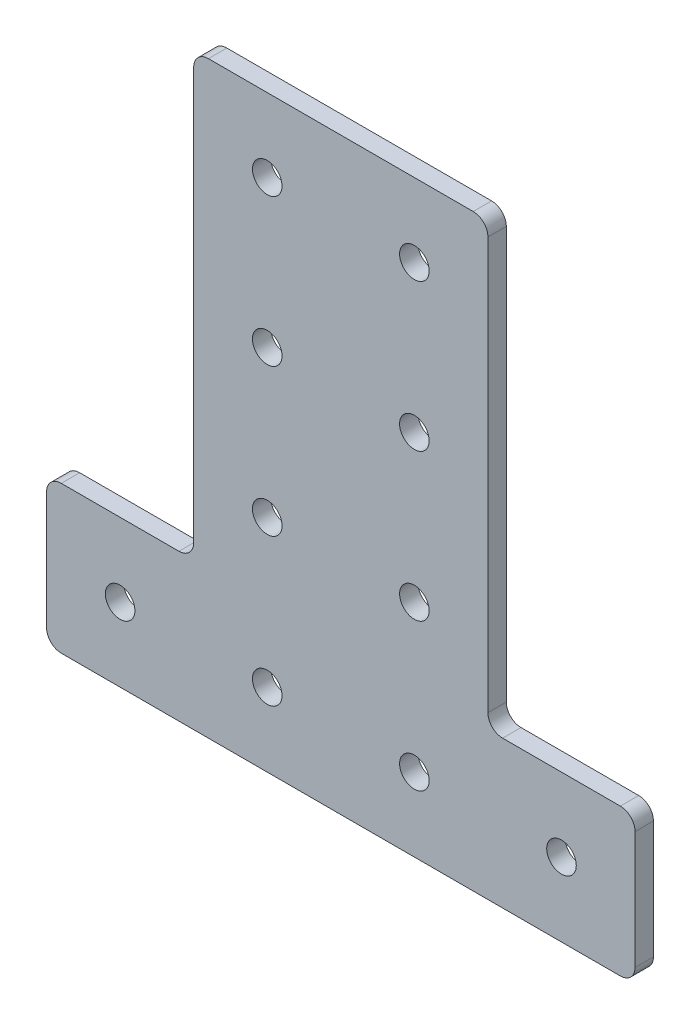
ISO-10303-21;
HEADER;
FILE_DESCRIPTION(('STEP AP214'),'2;1');
FILE_NAME('part.step','',(''),(''),'','','');
FILE_SCHEMA(('AUTOMOTIVE_DESIGN { 1 0 10303 214 1 1 1 1 }'));
ENDSEC;
DATA;
#1=APPLICATION_CONTEXT('core data for automotive mechanical design processes');
#2=APPLICATION_PROTOCOL_DEFINITION('international standard','automotive_design',2000,#1);
#3=PRODUCT_CONTEXT('',#1,'mechanical');
#4=PRODUCT('Part','Part','',(#3));
#5=PRODUCT_RELATED_PRODUCT_CATEGORY('part','',(#4));
#6=PRODUCT_DEFINITION_FORMATION('','',#4);
#7=PRODUCT_DEFINITION_CONTEXT('part definition',#1,'design');
#8=PRODUCT_DEFINITION('design','',#6,#7);
#9=PRODUCT_DEFINITION_SHAPE('','',#8);
#10=(LENGTH_UNIT() NAMED_UNIT(*) SI_UNIT(.MILLI.,.METRE.));
#11=(NAMED_UNIT(*) PLANE_ANGLE_UNIT() SI_UNIT($,.RADIAN.));
#12=(NAMED_UNIT(*) SI_UNIT($,.STERADIAN.) SOLID_ANGLE_UNIT());
#13=UNCERTAINTY_MEASURE_WITH_UNIT(LENGTH_MEASURE(1.E-05),#10,'distance_accuracy_value','');
#14=(GEOMETRIC_REPRESENTATION_CONTEXT(3) GLOBAL_UNCERTAINTY_ASSIGNED_CONTEXT((#13)) GLOBAL_UNIT_ASSIGNED_CONTEXT((#10,
#11,#12)) REPRESENTATION_CONTEXT('',''));
#15=CARTESIAN_POINT('',(0.,0.,0.));
#16=DIRECTION('',(0.,0.,1.));
#17=DIRECTION('',(1.,0.,0.));
#18=AXIS2_PLACEMENT_3D('',#15,#16,#17);
#19=CARTESIAN_POINT('',(0.,0.,3.175));
#20=DIRECTION('',(0.,0.,1.));
#21=DIRECTION('',(1.,0.,0.));
#22=AXIS2_PLACEMENT_3D('',#19,#20,#21);
#23=PLANE('',#22);
#24=CARTESIAN_POINT('',(-63.5,12.7,3.175));
#25=DIRECTION('',(0.,0.,1.));
#26=DIRECTION('',(1.,0.,0.));
#27=AXIS2_PLACEMENT_3D('',#24,#25,#26);
#28=CIRCLE('',#27,2.55269999999999);
#29=CARTESIAN_POINT('',(-60.9473,12.7,3.175));
#30=VERTEX_POINT('',#29);
#31=EDGE_CURVE('E465',#30,#30,#28,.F.);
#32=ORIENTED_EDGE('',*,*,#31,.T.);
#33=EDGE_LOOP('',(#32));
#34=FACE_BOUND('',#33,.T.);
#35=CARTESIAN_POINT('',(-38.1,12.7,3.175));
#36=DIRECTION('',(0.,0.,1.));
#37=DIRECTION('',(1.,0.,0.));
#38=AXIS2_PLACEMENT_3D('',#35,#36,#37);
#39=CIRCLE('',#38,2.55269999999999);
#40=CARTESIAN_POINT('',(-35.5473,12.7,3.175));
#41=VERTEX_POINT('',#40);
#42=EDGE_CURVE('E457',#41,#41,#39,.F.);
#43=ORIENTED_EDGE('',*,*,#42,.T.);
#44=EDGE_LOOP('',(#43));
#45=FACE_BOUND('',#44,.T.);
#46=CARTESIAN_POINT('',(-12.7,12.7,3.175));
#47=DIRECTION('',(0.,0.,1.));
#48=DIRECTION('',(1.,0.,0.));
#49=AXIS2_PLACEMENT_3D('',#46,#47,#48);
#50=CIRCLE('',#49,2.55269999999999);
#51=CARTESIAN_POINT('',(-10.1473,12.7,3.175));
#52=VERTEX_POINT('',#51);
#53=EDGE_CURVE('E446',#52,#52,#50,.F.);
#54=ORIENTED_EDGE('',*,*,#53,.T.);
#55=EDGE_LOOP('',(#54));
#56=FACE_BOUND('',#55,.T.);
#57=CARTESIAN_POINT('',(-63.5,88.9,3.175));
#58=DIRECTION('',(0.,0.,1.));
#59=DIRECTION('',(1.,0.,0.));
#60=AXIS2_PLACEMENT_3D('',#57,#58,#59);
#61=CIRCLE('',#60,2.55269999999999);
#62=CARTESIAN_POINT('',(-60.9473,88.9,3.175));
#63=VERTEX_POINT('',#62);
#64=EDGE_CURVE('E442',#63,#63,#61,.T.);
#65=ORIENTED_EDGE('',*,*,#64,.F.);
#66=EDGE_LOOP('',(#65));
#67=FACE_BOUND('',#66,.T.);
#68=CARTESIAN_POINT('',(-63.5,63.5,3.175));
#69=DIRECTION('',(0.,0.,1.));
#70=DIRECTION('',(1.,0.,0.));
#71=AXIS2_PLACEMENT_3D('',#68,#69,#70);
#72=CIRCLE('',#71,2.55269999999999);
#73=CARTESIAN_POINT('',(-60.9473,63.5,3.175));
#74=VERTEX_POINT('',#73);
#75=EDGE_CURVE('E434',#74,#74,#72,.T.);
#76=ORIENTED_EDGE('',*,*,#75,.F.);
#77=EDGE_LOOP('',(#76));
#78=FACE_BOUND('',#77,.T.);
#79=CARTESIAN_POINT('',(-63.5,38.1,3.175));
#80=DIRECTION('',(0.,0.,1.));
#81=DIRECTION('',(1.,0.,0.));
#82=AXIS2_PLACEMENT_3D('',#79,#80,#81);
#83=CIRCLE('',#82,2.55269999999999);
#84=CARTESIAN_POINT('',(-60.9473,38.1,3.175));
#85=VERTEX_POINT('',#84);
#86=EDGE_CURVE('E426',#85,#85,#83,.T.);
#87=ORIENTED_EDGE('',*,*,#86,.F.);
#88=EDGE_LOOP('',(#87));
#89=FACE_BOUND('',#88,.T.);
#90=CARTESIAN_POINT('',(-38.1,88.9,3.175));
#91=DIRECTION('',(0.,0.,1.));
#92=DIRECTION('',(1.,0.,0.));
#93=AXIS2_PLACEMENT_3D('',#90,#91,#92);
#94=CIRCLE('',#93,2.55269999999999);
#95=CARTESIAN_POINT('',(-35.5473,88.9,3.175));
#96=VERTEX_POINT('',#95);
#97=EDGE_CURVE('E418',#96,#96,#94,.T.);
#98=ORIENTED_EDGE('',*,*,#97,.F.);
#99=EDGE_LOOP('',(#98));
#100=FACE_BOUND('',#99,.T.);
#101=CARTESIAN_POINT('',(-38.1,63.5,3.175));
#102=DIRECTION('',(0.,0.,1.));
#103=DIRECTION('',(1.,0.,0.));
#104=AXIS2_PLACEMENT_3D('',#101,#102,#103);
#105=CIRCLE('',#104,2.55269999999999);
#106=CARTESIAN_POINT('',(-35.5473,63.5,3.175));
#107=VERTEX_POINT('',#106);
#108=EDGE_CURVE('E410',#107,#107,#105,.T.);
#109=ORIENTED_EDGE('',*,*,#108,.F.);
#110=EDGE_LOOP('',(#109));
#111=FACE_BOUND('',#110,.T.);
#112=CARTESIAN_POINT('',(-38.1,38.1,3.175));
#113=DIRECTION('',(0.,0.,1.));
#114=DIRECTION('',(1.,0.,0.));
#115=AXIS2_PLACEMENT_3D('',#112,#113,#114);
#116=CIRCLE('',#115,2.55269999999999);
#117=CARTESIAN_POINT('',(-35.5473,38.1,3.175));
#118=VERTEX_POINT('',#117);
#119=EDGE_CURVE('E402',#118,#118,#116,.T.);
#120=ORIENTED_EDGE('',*,*,#119,.F.);
#121=EDGE_LOOP('',(#120));
#122=FACE_BOUND('',#121,.T.);
#123=DIRECTION('',(0.,-1.,0.));
#124=VECTOR('',#123,1.);
#125=CARTESIAN_POINT('',(-101.6,0.,3.175));
#126=LINE('',#125,#124);
#127=CARTESIAN_POINT('',(-101.6,22.86,3.175));
#128=VERTEX_POINT('',#127);
#129=CARTESIAN_POINT('',(-101.6,2.53999999999999,3.175));
#130=VERTEX_POINT('',#129);
#131=EDGE_CURVE('E327',#128,#130,#126,.T.);
#132=ORIENTED_EDGE('',*,*,#131,.T.);
#133=CARTESIAN_POINT('',(-99.06,2.53999999999999,3.175));
#134=DIRECTION('',(0.,0.,1.));
#135=DIRECTION('',(1.,0.,0.));
#136=AXIS2_PLACEMENT_3D('',#133,#134,#135);
#137=CIRCLE('',#136,2.54);
#138=CARTESIAN_POINT('',(-99.06,0.,3.175));
#139=VERTEX_POINT('',#138);
#140=EDGE_CURVE('E268',#130,#139,#137,.T.);
#141=ORIENTED_EDGE('',*,*,#140,.T.);
#142=DIRECTION('',(1.,0.,0.));
#143=VECTOR('',#142,1.);
#144=CARTESIAN_POINT('',(0.,0.,3.175));
#145=LINE('',#144,#143);
#146=CARTESIAN_POINT('',(-2.54,0.,3.175));
#147=VERTEX_POINT('',#146);
#148=EDGE_CURVE('E202',#139,#147,#145,.T.);
#149=ORIENTED_EDGE('',*,*,#148,.T.);
#150=CARTESIAN_POINT('',(-2.54,2.54,3.175));
#151=DIRECTION('',(0.,0.,1.));
#152=DIRECTION('',(1.,0.,0.));
#153=AXIS2_PLACEMENT_3D('',#150,#151,#152);
#154=CIRCLE('',#153,2.54);
#155=CARTESIAN_POINT('',(0.,2.54,3.175));
#156=VERTEX_POINT('',#155);
#157=EDGE_CURVE('E257',#147,#156,#154,.T.);
#158=ORIENTED_EDGE('',*,*,#157,.T.);
#159=DIRECTION('',(0.,1.,0.));
#160=VECTOR('',#159,1.);
#161=CARTESIAN_POINT('',(0.,0.,3.175));
#162=LINE('',#161,#160);
#163=CARTESIAN_POINT('',(0.,22.86,3.175));
#164=VERTEX_POINT('',#163);
#165=EDGE_CURVE('E200',#156,#164,#162,.T.);
#166=ORIENTED_EDGE('',*,*,#165,.T.);
#167=CARTESIAN_POINT('',(-2.54,22.86,3.175));
#168=DIRECTION('',(0.,0.,1.));
#169=DIRECTION('',(1.,0.,0.));
#170=AXIS2_PLACEMENT_3D('',#167,#168,#169);
#171=CIRCLE('',#170,2.54);
#172=CARTESIAN_POINT('',(-2.54,25.4,3.175));
#173=VERTEX_POINT('',#172);
#174=EDGE_CURVE('E254',#164,#173,#171,.T.);
#175=ORIENTED_EDGE('',*,*,#174,.T.);
#176=DIRECTION('',(-1.,0.,0.));
#177=VECTOR('',#176,1.);
#178=CARTESIAN_POINT('',(0.,25.4,3.175));
#179=LINE('',#178,#177);
#180=CARTESIAN_POINT('',(-22.86,25.4,3.175));
#181=VERTEX_POINT('',#180);
#182=EDGE_CURVE('E308',#173,#181,#179,.T.);
#183=ORIENTED_EDGE('',*,*,#182,.T.);
#184=CARTESIAN_POINT('',(-22.86,27.94,3.175));
#185=DIRECTION('',(0.,0.,1.));
#186=DIRECTION('',(1.,0.,0.));
#187=AXIS2_PLACEMENT_3D('',#184,#185,#186);
#188=CIRCLE('',#187,2.54);
#189=CARTESIAN_POINT('',(-25.4,27.94,3.175));
#190=VERTEX_POINT('',#189);
#191=EDGE_CURVE('E11',#181,#190,#188,.F.);
#192=ORIENTED_EDGE('',*,*,#191,.T.);
#193=DIRECTION('',(0.,1.,0.));
#194=VECTOR('',#193,1.);
#195=CARTESIAN_POINT('',(-25.4,25.4,3.175));
#196=LINE('',#195,#194);
#197=CARTESIAN_POINT('',(-25.4,99.06,3.175));
#198=VERTEX_POINT('',#197);
#199=EDGE_CURVE('E307',#190,#198,#196,.T.);
#200=ORIENTED_EDGE('',*,*,#199,.T.);
#201=CARTESIAN_POINT('',(-27.94,99.06,3.175));
#202=DIRECTION('',(0.,0.,1.));
#203=DIRECTION('',(1.,0.,0.));
#204=AXIS2_PLACEMENT_3D('',#201,#202,#203);
#205=CIRCLE('',#204,2.54);
#206=CARTESIAN_POINT('',(-27.94,101.6,3.175));
#207=VERTEX_POINT('',#206);
#208=EDGE_CURVE('E61',#198,#207,#205,.T.);
#209=ORIENTED_EDGE('',*,*,#208,.T.);
#210=DIRECTION('',(-1.,0.,0.));
#211=VECTOR('',#210,1.);
#212=CARTESIAN_POINT('',(-76.2,101.6,3.175));
#213=LINE('',#212,#211);
#214=CARTESIAN_POINT('',(-73.66,101.6,3.175));
#215=VERTEX_POINT('',#214);
#216=EDGE_CURVE('E313',#207,#215,#213,.T.);
#217=ORIENTED_EDGE('',*,*,#216,.T.);
#218=CARTESIAN_POINT('',(-73.66,99.06,3.175));
#219=DIRECTION('',(0.,0.,1.));
#220=DIRECTION('',(1.,0.,0.));
#221=AXIS2_PLACEMENT_3D('',#218,#219,#220);
#222=CIRCLE('',#221,2.54);
#223=CARTESIAN_POINT('',(-76.2,99.06,3.175));
#224=VERTEX_POINT('',#223);
#225=EDGE_CURVE('E262',#215,#224,#222,.T.);
#226=ORIENTED_EDGE('',*,*,#225,.T.);
#227=DIRECTION('',(0.,-1.,0.));
#228=VECTOR('',#227,1.);
#229=CARTESIAN_POINT('',(-76.2,25.4,3.175));
#230=LINE('',#229,#228);
#231=CARTESIAN_POINT('',(-76.2,27.94,3.175));
#232=VERTEX_POINT('',#231);
#233=EDGE_CURVE('E317',#224,#232,#230,.T.);
#234=ORIENTED_EDGE('',*,*,#233,.T.);
#235=CARTESIAN_POINT('',(-78.74,27.94,3.175));
#236=DIRECTION('',(0.,0.,1.));
#237=DIRECTION('',(1.,0.,0.));
#238=AXIS2_PLACEMENT_3D('',#235,#236,#237);
#239=CIRCLE('',#238,2.54);
#240=CARTESIAN_POINT('',(-78.74,25.4,3.175));
#241=VERTEX_POINT('',#240);
#242=EDGE_CURVE('E164',#232,#241,#239,.F.);
#243=ORIENTED_EDGE('',*,*,#242,.T.);
#244=DIRECTION('',(-1.,0.,0.));
#245=VECTOR('',#244,1.);
#246=CARTESIAN_POINT('',(-76.2,25.4,3.175));
#247=LINE('',#246,#245);
#248=CARTESIAN_POINT('',(-99.06,25.4,3.175));
#249=VERTEX_POINT('',#248);
#250=EDGE_CURVE('E174',#241,#249,#247,.T.);
#251=ORIENTED_EDGE('',*,*,#250,.T.);
#252=CARTESIAN_POINT('',(-99.06,22.86,3.175));
#253=DIRECTION('',(0.,0.,1.));
#254=DIRECTION('',(1.,0.,0.));
#255=AXIS2_PLACEMENT_3D('',#252,#253,#254);
#256=CIRCLE('',#255,2.54);
#257=EDGE_CURVE('E265',#249,#128,#256,.T.);
#258=ORIENTED_EDGE('',*,*,#257,.T.);
#259=EDGE_LOOP('',(#132,#141,#149,#158,#166,#175,#183,#192,#200,#209,#217,#226,#234,#243,#251,#258));
#260=FACE_BOUND('',#259,.T.);
#261=CARTESIAN_POINT('',(-88.9,12.7,3.175));
#262=DIRECTION('',(0.,0.,1.));
#263=DIRECTION('',(1.,0.,0.));
#264=AXIS2_PLACEMENT_3D('',#261,#262,#263);
#265=CIRCLE('',#264,2.5527);
#266=CARTESIAN_POINT('',(-86.3473,12.7,3.175));
#267=VERTEX_POINT('',#266);
#268=EDGE_CURVE('E472',#267,#267,#265,.F.);
#269=ORIENTED_EDGE('',*,*,#268,.T.);
#270=EDGE_LOOP('',(#269));
#271=FACE_BOUND('',#270,.T.);
#272=ADVANCED_FACE('F38',(#34,#45,#56,#67,#78,#89,#100,#111,#122,#260,#271),#23,.T.);
#273=CARTESIAN_POINT('',(0.,0.,0.));
#274=DIRECTION('',(0.,0.,1.));
#275=DIRECTION('',(1.,0.,0.));
#276=AXIS2_PLACEMENT_3D('',#273,#274,#275);
#277=PLANE('',#276);
#278=CARTESIAN_POINT('',(-88.9,12.7,0.));
#279=DIRECTION('',(0.,0.,-1.));
#280=DIRECTION('',(-1.,0.,0.));
#281=AXIS2_PLACEMENT_3D('',#278,#279,#280);
#282=CIRCLE('',#281,2.55269999999999);
#283=CARTESIAN_POINT('',(-91.4527,12.7,0.));
#284=VERTEX_POINT('',#283);
#285=EDGE_CURVE('E476',#284,#284,#282,.T.);
#286=ORIENTED_EDGE('',*,*,#285,.F.);
#287=EDGE_LOOP('',(#286));
#288=FACE_BOUND('',#287,.T.);
#289=CARTESIAN_POINT('',(-63.5,12.7,0.));
#290=DIRECTION('',(0.,0.,-1.));
#291=DIRECTION('',(-1.,0.,0.));
#292=AXIS2_PLACEMENT_3D('',#289,#290,#291);
#293=CIRCLE('',#292,2.55269999999999);
#294=CARTESIAN_POINT('',(-66.0527,12.7,0.));
#295=VERTEX_POINT('',#294);
#296=EDGE_CURVE('E468',#295,#295,#293,.T.);
#297=ORIENTED_EDGE('',*,*,#296,.F.);
#298=EDGE_LOOP('',(#297));
#299=FACE_BOUND('',#298,.T.);
#300=CARTESIAN_POINT('',(-38.1,12.7,0.));
#301=DIRECTION('',(0.,0.,-1.));
#302=DIRECTION('',(-1.,0.,0.));
#303=AXIS2_PLACEMENT_3D('',#300,#301,#302);
#304=CIRCLE('',#303,2.55269999999999);
#305=CARTESIAN_POINT('',(-40.6527,12.7,0.));
#306=VERTEX_POINT('',#305);
#307=EDGE_CURVE('E461',#306,#306,#304,.T.);
#308=ORIENTED_EDGE('',*,*,#307,.F.);
#309=EDGE_LOOP('',(#308));
#310=FACE_BOUND('',#309,.T.);
#311=CARTESIAN_POINT('',(-12.7,12.7,0.));
#312=DIRECTION('',(0.,0.,-1.));
#313=DIRECTION('',(-1.,0.,0.));
#314=AXIS2_PLACEMENT_3D('',#311,#312,#313);
#315=CIRCLE('',#314,2.55269999999999);
#316=CARTESIAN_POINT('',(-15.2527,12.7,0.));
#317=VERTEX_POINT('',#316);
#318=EDGE_CURVE('E453',#317,#317,#315,.T.);
#319=ORIENTED_EDGE('',*,*,#318,.F.);
#320=EDGE_LOOP('',(#319));
#321=FACE_BOUND('',#320,.T.);
#322=CARTESIAN_POINT('',(-63.5,38.1,0.));
#323=DIRECTION('',(0.,0.,1.));
#324=DIRECTION('',(1.,0.,0.));
#325=AXIS2_PLACEMENT_3D('',#322,#323,#324);
#326=CIRCLE('',#325,2.55269999999999);
#327=CARTESIAN_POINT('',(-60.9473,38.1,0.));
#328=VERTEX_POINT('',#327);
#329=EDGE_CURVE('E422',#328,#328,#326,.F.);
#330=ORIENTED_EDGE('',*,*,#329,.F.);
#331=EDGE_LOOP('',(#330));
#332=FACE_BOUND('',#331,.T.);
#333=CARTESIAN_POINT('',(-38.1,88.9,0.));
#334=DIRECTION('',(0.,0.,1.));
#335=DIRECTION('',(1.,0.,0.));
#336=AXIS2_PLACEMENT_3D('',#333,#334,#335);
#337=CIRCLE('',#336,2.55269999999999);
#338=CARTESIAN_POINT('',(-35.5473,88.9,0.));
#339=VERTEX_POINT('',#338);
#340=EDGE_CURVE('E414',#339,#339,#337,.F.);
#341=ORIENTED_EDGE('',*,*,#340,.F.);
#342=EDGE_LOOP('',(#341));
#343=FACE_BOUND('',#342,.T.);
#344=CARTESIAN_POINT('',(-38.1,38.1,0.));
#345=DIRECTION('',(0.,0.,1.));
#346=DIRECTION('',(1.,0.,0.));
#347=AXIS2_PLACEMENT_3D('',#344,#345,#346);
#348=CIRCLE('',#347,2.55269999999999);
#349=CARTESIAN_POINT('',(-35.5473,38.1,0.));
#350=VERTEX_POINT('',#349);
#351=EDGE_CURVE('E335',#350,#350,#348,.F.);
#352=ORIENTED_EDGE('',*,*,#351,.F.);
#353=EDGE_LOOP('',(#352));
#354=FACE_BOUND('',#353,.T.);
#355=DIRECTION('',(1.,0.,0.));
#356=VECTOR('',#355,1.);
#357=CARTESIAN_POINT('',(0.,0.,0.));
#358=LINE('',#357,#356);
#359=CARTESIAN_POINT('',(-99.06,0.,0.));
#360=VERTEX_POINT('',#359);
#361=CARTESIAN_POINT('',(-2.54,0.,0.));
#362=VERTEX_POINT('',#361);
#363=EDGE_CURVE('E191',#360,#362,#358,.T.);
#364=ORIENTED_EDGE('',*,*,#363,.F.);
#365=CARTESIAN_POINT('',(-99.06,2.53999999999999,0.));
#366=DIRECTION('',(0.,0.,1.));
#367=DIRECTION('',(1.,0.,0.));
#368=AXIS2_PLACEMENT_3D('',#365,#366,#367);
#369=CIRCLE('',#368,2.54);
#370=CARTESIAN_POINT('',(-101.6,2.53999999999999,0.));
#371=VERTEX_POINT('',#370);
#372=EDGE_CURVE('E244',#360,#371,#369,.F.);
#373=ORIENTED_EDGE('',*,*,#372,.T.);
#374=DIRECTION('',(0.,-1.,0.));
#375=VECTOR('',#374,1.);
#376=CARTESIAN_POINT('',(-101.6,0.,0.));
#377=LINE('',#376,#375);
#378=CARTESIAN_POINT('',(-101.6,22.86,0.));
#379=VERTEX_POINT('',#378);
#380=EDGE_CURVE('E185',#379,#371,#377,.T.);
#381=ORIENTED_EDGE('',*,*,#380,.F.);
#382=CARTESIAN_POINT('',(-99.06,22.86,0.));
#383=DIRECTION('',(0.,0.,1.));
#384=DIRECTION('',(1.,0.,0.));
#385=AXIS2_PLACEMENT_3D('',#382,#383,#384);
#386=CIRCLE('',#385,2.54);
#387=CARTESIAN_POINT('',(-99.06,25.4,0.));
#388=VERTEX_POINT('',#387);
#389=EDGE_CURVE('E183',#379,#388,#386,.F.);
#390=ORIENTED_EDGE('',*,*,#389,.T.);
#391=DIRECTION('',(-1.,0.,0.));
#392=VECTOR('',#391,1.);
#393=CARTESIAN_POINT('',(-76.2,25.4,0.));
#394=LINE('',#393,#392);
#395=CARTESIAN_POINT('',(-78.74,25.4,0.));
#396=VERTEX_POINT('',#395);
#397=EDGE_CURVE('E171',#396,#388,#394,.T.);
#398=ORIENTED_EDGE('',*,*,#397,.F.);
#399=CARTESIAN_POINT('',(-78.74,27.94,0.));
#400=DIRECTION('',(0.,0.,1.));
#401=DIRECTION('',(1.,0.,0.));
#402=AXIS2_PLACEMENT_3D('',#399,#400,#401);
#403=CIRCLE('',#402,2.54);
#404=CARTESIAN_POINT('',(-76.2,27.94,0.));
#405=VERTEX_POINT('',#404);
#406=EDGE_CURVE('E153',#396,#405,#403,.T.);
#407=ORIENTED_EDGE('',*,*,#406,.T.);
#408=DIRECTION('',(0.,-1.,0.));
#409=VECTOR('',#408,1.);
#410=CARTESIAN_POINT('',(-76.2,25.4,0.));
#411=LINE('',#410,#409);
#412=CARTESIAN_POINT('',(-76.2,99.06,0.));
#413=VERTEX_POINT('',#412);
#414=EDGE_CURVE('E186',#413,#405,#411,.T.);
#415=ORIENTED_EDGE('',*,*,#414,.F.);
#416=CARTESIAN_POINT('',(-73.66,99.06,0.));
#417=DIRECTION('',(0.,0.,1.));
#418=DIRECTION('',(1.,0.,0.));
#419=AXIS2_PLACEMENT_3D('',#416,#417,#418);
#420=CIRCLE('',#419,2.54);
#421=CARTESIAN_POINT('',(-73.66,101.6,0.));
#422=VERTEX_POINT('',#421);
#423=EDGE_CURVE('E239',#413,#422,#420,.F.);
#424=ORIENTED_EDGE('',*,*,#423,.T.);
#425=DIRECTION('',(-1.,0.,0.));
#426=VECTOR('',#425,1.);
#427=CARTESIAN_POINT('',(-76.2,101.6,0.));
#428=LINE('',#427,#426);
#429=CARTESIAN_POINT('',(-27.94,101.6,0.));
#430=VERTEX_POINT('',#429);
#431=EDGE_CURVE('E193',#430,#422,#428,.T.);
#432=ORIENTED_EDGE('',*,*,#431,.F.);
#433=CARTESIAN_POINT('',(-27.94,99.06,0.));
#434=DIRECTION('',(0.,0.,1.));
#435=DIRECTION('',(1.,0.,0.));
#436=AXIS2_PLACEMENT_3D('',#433,#434,#435);
#437=CIRCLE('',#436,2.54);
#438=CARTESIAN_POINT('',(-25.4,99.06,0.));
#439=VERTEX_POINT('',#438);
#440=EDGE_CURVE('E236',#430,#439,#437,.F.);
#441=ORIENTED_EDGE('',*,*,#440,.T.);
#442=DIRECTION('',(0.,1.,0.));
#443=VECTOR('',#442,1.);
#444=CARTESIAN_POINT('',(-25.4,25.4,0.));
#445=LINE('',#444,#443);
#446=CARTESIAN_POINT('',(-25.4,27.94,0.));
#447=VERTEX_POINT('',#446);
#448=EDGE_CURVE('E290',#447,#439,#445,.T.);
#449=ORIENTED_EDGE('',*,*,#448,.F.);
#450=CARTESIAN_POINT('',(-22.86,27.94,0.));
#451=DIRECTION('',(0.,0.,1.));
#452=DIRECTION('',(1.,0.,0.));
#453=AXIS2_PLACEMENT_3D('',#450,#451,#452);
#454=CIRCLE('',#453,2.54);
#455=CARTESIAN_POINT('',(-22.86,25.4,0.));
#456=VERTEX_POINT('',#455);
#457=EDGE_CURVE('E47',#447,#456,#454,.T.);
#458=ORIENTED_EDGE('',*,*,#457,.T.);
#459=DIRECTION('',(-1.,0.,0.));
#460=VECTOR('',#459,1.);
#461=CARTESIAN_POINT('',(0.,25.4,0.));
#462=LINE('',#461,#460);
#463=CARTESIAN_POINT('',(-2.54,25.4,0.));
#464=VERTEX_POINT('',#463);
#465=EDGE_CURVE('E288',#464,#456,#462,.T.);
#466=ORIENTED_EDGE('',*,*,#465,.F.);
#467=CARTESIAN_POINT('',(-2.54,22.86,0.));
#468=DIRECTION('',(0.,0.,1.));
#469=DIRECTION('',(1.,0.,0.));
#470=AXIS2_PLACEMENT_3D('',#467,#468,#469);
#471=CIRCLE('',#470,2.54);
#472=CARTESIAN_POINT('',(0.,22.86,0.));
#473=VERTEX_POINT('',#472);
#474=EDGE_CURVE('E230',#464,#473,#471,.F.);
#475=ORIENTED_EDGE('',*,*,#474,.T.);
#476=DIRECTION('',(0.,1.,0.));
#477=VECTOR('',#476,1.);
#478=CARTESIAN_POINT('',(0.,0.,0.));
#479=LINE('',#478,#477);
#480=CARTESIAN_POINT('',(0.,2.54,0.));
#481=VERTEX_POINT('',#480);
#482=EDGE_CURVE('E300',#481,#473,#479,.T.);
#483=ORIENTED_EDGE('',*,*,#482,.F.);
#484=CARTESIAN_POINT('',(-2.54,2.54,0.));
#485=DIRECTION('',(0.,0.,1.));
#486=DIRECTION('',(1.,0.,0.));
#487=AXIS2_PLACEMENT_3D('',#484,#485,#486);
#488=CIRCLE('',#487,2.54);
#489=EDGE_CURVE('E233',#481,#362,#488,.F.);
#490=ORIENTED_EDGE('',*,*,#489,.T.);
#491=EDGE_LOOP('',(#364,#373,#381,#390,#398,#407,#415,#424,#432,#441,#449,#458,#466,#475,#483,#490));
#492=FACE_BOUND('',#491,.T.);
#493=CARTESIAN_POINT('',(-38.1,63.5,0.));
#494=DIRECTION('',(0.,0.,1.));
#495=DIRECTION('',(1.,0.,0.));
#496=AXIS2_PLACEMENT_3D('',#493,#494,#495);
#497=CIRCLE('',#496,2.55269999999999);
#498=CARTESIAN_POINT('',(-35.5473,63.5,0.));
#499=VERTEX_POINT('',#498);
#500=EDGE_CURVE('E406',#499,#499,#497,.F.);
#501=ORIENTED_EDGE('',*,*,#500,.F.);
#502=EDGE_LOOP('',(#501));
#503=FACE_BOUND('',#502,.T.);
#504=CARTESIAN_POINT('',(-63.5,63.5,0.));
#505=DIRECTION('',(0.,0.,1.));
#506=DIRECTION('',(1.,0.,0.));
#507=AXIS2_PLACEMENT_3D('',#504,#505,#506);
#508=CIRCLE('',#507,2.55269999999999);
#509=CARTESIAN_POINT('',(-60.9473,63.5,0.));
#510=VERTEX_POINT('',#509);
#511=EDGE_CURVE('E430',#510,#510,#508,.F.);
#512=ORIENTED_EDGE('',*,*,#511,.F.);
#513=EDGE_LOOP('',(#512));
#514=FACE_BOUND('',#513,.T.);
#515=CARTESIAN_POINT('',(-63.5,88.9,0.));
#516=DIRECTION('',(0.,0.,1.));
#517=DIRECTION('',(1.,0.,0.));
#518=AXIS2_PLACEMENT_3D('',#515,#516,#517);
#519=CIRCLE('',#518,2.55269999999999);
#520=CARTESIAN_POINT('',(-60.9473,88.9,0.));
#521=VERTEX_POINT('',#520);
#522=EDGE_CURVE('E438',#521,#521,#519,.F.);
#523=ORIENTED_EDGE('',*,*,#522,.F.);
#524=EDGE_LOOP('',(#523));
#525=FACE_BOUND('',#524,.T.);
#526=ADVANCED_FACE('F180',(#288,#299,#310,#321,#332,#343,#354,#492,#503,#514,#525),#277,.F.);
#527=CARTESIAN_POINT('',(0.,0.,3.175));
#528=DIRECTION('',(-1.,0.,0.));
#529=DIRECTION('',(0.,0.,1.));
#530=AXIS2_PLACEMENT_3D('',#527,#528,#529);
#531=PLANE('',#530);
#532=ORIENTED_EDGE('',*,*,#165,.F.);
#533=DIRECTION('',(0.,0.,-1.));
#534=VECTOR('',#533,1.);
#535=CARTESIAN_POINT('',(0.,2.54,3.175));
#536=LINE('',#535,#534);
#537=EDGE_CURVE('E165',#156,#481,#536,.T.);
#538=ORIENTED_EDGE('',*,*,#537,.T.);
#539=ORIENTED_EDGE('',*,*,#482,.T.);
#540=DIRECTION('',(0.,0.,-1.));
#541=VECTOR('',#540,1.);
#542=CARTESIAN_POINT('',(0.,22.86,3.175));
#543=LINE('',#542,#541);
#544=EDGE_CURVE('E277',#473,#164,#543,.F.);
#545=ORIENTED_EDGE('',*,*,#544,.T.);
#546=EDGE_LOOP('',(#532,#538,#539,#545));
#547=FACE_BOUND('',#546,.T.);
#548=ADVANCED_FACE('F364',(#547),#531,.F.);
#549=CARTESIAN_POINT('',(0.,25.4,3.175));
#550=DIRECTION('',(0.,-1.,0.));
#551=DIRECTION('',(1.,0.,0.));
#552=AXIS2_PLACEMENT_3D('',#549,#550,#551);
#553=PLANE('',#552);
#554=ORIENTED_EDGE('',*,*,#465,.T.);
#555=DIRECTION('',(0.,0.,-1.));
#556=VECTOR('',#555,1.);
#557=CARTESIAN_POINT('',(-22.86,25.4,3.175));
#558=LINE('',#557,#556);
#559=EDGE_CURVE('E220',#456,#181,#558,.F.);
#560=ORIENTED_EDGE('',*,*,#559,.T.);
#561=ORIENTED_EDGE('',*,*,#182,.F.);
#562=DIRECTION('',(0.,0.,-1.));
#563=VECTOR('',#562,1.);
#564=CARTESIAN_POINT('',(-2.54,25.4,3.175));
#565=LINE('',#564,#563);
#566=EDGE_CURVE('E216',#173,#464,#565,.T.);
#567=ORIENTED_EDGE('',*,*,#566,.T.);
#568=EDGE_LOOP('',(#554,#560,#561,#567));
#569=FACE_BOUND('',#568,.T.);
#570=ADVANCED_FACE('F295',(#569),#553,.F.);
#571=CARTESIAN_POINT('',(-25.4,25.4,3.175));
#572=DIRECTION('',(-1.,0.,0.));
#573=DIRECTION('',(0.,-1.,0.));
#574=AXIS2_PLACEMENT_3D('',#571,#572,#573);
#575=PLANE('',#574);
#576=ORIENTED_EDGE('',*,*,#199,.F.);
#577=DIRECTION('',(0.,0.,-1.));
#578=VECTOR('',#577,1.);
#579=CARTESIAN_POINT('',(-25.4,27.94,0.));
#580=LINE('',#579,#578);
#581=EDGE_CURVE('E212',#190,#447,#580,.T.);
#582=ORIENTED_EDGE('',*,*,#581,.T.);
#583=ORIENTED_EDGE('',*,*,#448,.T.);
#584=DIRECTION('',(0.,0.,-1.));
#585=VECTOR('',#584,1.);
#586=CARTESIAN_POINT('',(-25.4,99.06,3.175));
#587=LINE('',#586,#585);
#588=EDGE_CURVE('E209',#439,#198,#587,.F.);
#589=ORIENTED_EDGE('',*,*,#588,.T.);
#590=EDGE_LOOP('',(#576,#582,#583,#589));
#591=FACE_BOUND('',#590,.T.);
#592=ADVANCED_FACE('F310',(#591),#575,.F.);
#593=CARTESIAN_POINT('',(-76.2,101.6,3.175));
#594=DIRECTION('',(0.,-1.,0.));
#595=DIRECTION('',(0.,0.,-1.));
#596=AXIS2_PLACEMENT_3D('',#593,#594,#595);
#597=PLANE('',#596);
#598=ORIENTED_EDGE('',*,*,#431,.T.);
#599=DIRECTION('',(0.,0.,-1.));
#600=VECTOR('',#599,1.);
#601=CARTESIAN_POINT('',(-73.66,101.6,3.175));
#602=LINE('',#601,#600);
#603=EDGE_CURVE('E54',#422,#215,#602,.F.);
#604=ORIENTED_EDGE('',*,*,#603,.T.);
#605=ORIENTED_EDGE('',*,*,#216,.F.);
#606=DIRECTION('',(0.,0.,-1.));
#607=VECTOR('',#606,1.);
#608=CARTESIAN_POINT('',(-27.94,101.6,3.175));
#609=LINE('',#608,#607);
#610=EDGE_CURVE('E271',#207,#430,#609,.T.);
#611=ORIENTED_EDGE('',*,*,#610,.T.);
#612=EDGE_LOOP('',(#598,#604,#605,#611));
#613=FACE_BOUND('',#612,.T.);
#614=ADVANCED_FACE('F340',(#613),#597,.F.);
#615=CARTESIAN_POINT('',(-76.2,25.4,3.175));
#616=DIRECTION('',(1.,0.,0.));
#617=DIRECTION('',(0.,0.,-1.));
#618=AXIS2_PLACEMENT_3D('',#615,#616,#617);
#619=PLANE('',#618);
#620=ORIENTED_EDGE('',*,*,#414,.T.);
#621=DIRECTION('',(0.,0.,-1.));
#622=VECTOR('',#621,1.);
#623=CARTESIAN_POINT('',(-76.2,27.94,3.175));
#624=LINE('',#623,#622);
#625=EDGE_CURVE('E158',#405,#232,#624,.F.);
#626=ORIENTED_EDGE('',*,*,#625,.T.);
#627=ORIENTED_EDGE('',*,*,#233,.F.);
#628=DIRECTION('',(0.,0.,-1.));
#629=VECTOR('',#628,1.);
#630=CARTESIAN_POINT('',(-76.2,99.06,3.175));
#631=LINE('',#630,#629);
#632=EDGE_CURVE('E176',#224,#413,#631,.T.);
#633=ORIENTED_EDGE('',*,*,#632,.T.);
#634=EDGE_LOOP('',(#620,#626,#627,#633));
#635=FACE_BOUND('',#634,.T.);
#636=ADVANCED_FACE('F348',(#635),#619,.F.);
#637=CARTESIAN_POINT('',(-76.2,25.4,3.175));
#638=DIRECTION('',(0.,-1.,0.));
#639=DIRECTION('',(1.,0.,0.));
#640=AXIS2_PLACEMENT_3D('',#637,#638,#639);
#641=PLANE('',#640);
#642=ORIENTED_EDGE('',*,*,#250,.F.);
#643=DIRECTION('',(0.,0.,-1.));
#644=VECTOR('',#643,1.);
#645=CARTESIAN_POINT('',(-78.74,25.4,0.));
#646=LINE('',#645,#644);
#647=EDGE_CURVE('E157',#241,#396,#646,.T.);
#648=ORIENTED_EDGE('',*,*,#647,.T.);
#649=ORIENTED_EDGE('',*,*,#397,.T.);
#650=DIRECTION('',(0.,0.,-1.));
#651=VECTOR('',#650,1.);
#652=CARTESIAN_POINT('',(-99.06,25.4,3.175));
#653=LINE('',#652,#651);
#654=EDGE_CURVE('E177',#388,#249,#653,.F.);
#655=ORIENTED_EDGE('',*,*,#654,.T.);
#656=EDGE_LOOP('',(#642,#648,#649,#655));
#657=FACE_BOUND('',#656,.T.);
#658=ADVANCED_FACE('F170',(#657),#641,.F.);
#659=CARTESIAN_POINT('',(-101.6,0.,3.175));
#660=DIRECTION('',(1.,0.,0.));
#661=DIRECTION('',(0.,0.,-1.));
#662=AXIS2_PLACEMENT_3D('',#659,#660,#661);
#663=PLANE('',#662);
#664=ORIENTED_EDGE('',*,*,#380,.T.);
#665=DIRECTION('',(0.,0.,-1.));
#666=VECTOR('',#665,1.);
#667=CARTESIAN_POINT('',(-101.6,2.53999999999999,3.175));
#668=LINE('',#667,#666);
#669=EDGE_CURVE('E251',#371,#130,#668,.F.);
#670=ORIENTED_EDGE('',*,*,#669,.T.);
#671=ORIENTED_EDGE('',*,*,#131,.F.);
#672=DIRECTION('',(0.,0.,-1.));
#673=VECTOR('',#672,1.);
#674=CARTESIAN_POINT('',(-101.6,22.86,3.175));
#675=LINE('',#674,#673);
#676=EDGE_CURVE('E247',#128,#379,#675,.T.);
#677=ORIENTED_EDGE('',*,*,#676,.T.);
#678=EDGE_LOOP('',(#664,#670,#671,#677));
#679=FACE_BOUND('',#678,.T.);
#680=ADVANCED_FACE('F355',(#679),#663,.F.);
#681=CARTESIAN_POINT('',(0.,0.,3.175));
#682=DIRECTION('',(0.,1.,0.));
#683=DIRECTION('',(-1.,0.,0.));
#684=AXIS2_PLACEMENT_3D('',#681,#682,#683);
#685=PLANE('',#684);
#686=ORIENTED_EDGE('',*,*,#148,.F.);
#687=DIRECTION('',(0.,0.,-1.));
#688=VECTOR('',#687,1.);
#689=CARTESIAN_POINT('',(-99.06,0.,3.175));
#690=LINE('',#689,#688);
#691=EDGE_CURVE('E226',#139,#360,#690,.T.);
#692=ORIENTED_EDGE('',*,*,#691,.T.);
#693=ORIENTED_EDGE('',*,*,#363,.T.);
#694=DIRECTION('',(0.,0.,-1.));
#695=VECTOR('',#694,1.);
#696=CARTESIAN_POINT('',(-2.54,0.,3.175));
#697=LINE('',#696,#695);
#698=EDGE_CURVE('E223',#362,#147,#697,.F.);
#699=ORIENTED_EDGE('',*,*,#698,.T.);
#700=EDGE_LOOP('',(#686,#692,#693,#699));
#701=FACE_BOUND('',#700,.T.);
#702=ADVANCED_FACE('F373',(#701),#685,.F.);
#703=CARTESIAN_POINT('',(-78.74,27.94,3.175));
#704=DIRECTION('',(0.,0.,1.));
#705=DIRECTION('',(1.,0.,0.));
#706=AXIS2_PLACEMENT_3D('',#703,#704,#705);
#707=CYLINDRICAL_SURFACE('',#706,2.54);
#708=ORIENTED_EDGE('',*,*,#242,.F.);
#709=ORIENTED_EDGE('',*,*,#625,.F.);
#710=ORIENTED_EDGE('',*,*,#406,.F.);
#711=ORIENTED_EDGE('',*,*,#647,.F.);
#712=EDGE_LOOP('',(#708,#709,#710,#711));
#713=FACE_BOUND('',#712,.T.);
#714=ADVANCED_FACE('F156',(#713),#707,.F.);
#715=CARTESIAN_POINT('',(-22.86,27.94,3.175));
#716=DIRECTION('',(0.,0.,1.));
#717=DIRECTION('',(1.,0.,0.));
#718=AXIS2_PLACEMENT_3D('',#715,#716,#717);
#719=CYLINDRICAL_SURFACE('',#718,2.54);
#720=ORIENTED_EDGE('',*,*,#191,.F.);
#721=ORIENTED_EDGE('',*,*,#559,.F.);
#722=ORIENTED_EDGE('',*,*,#457,.F.);
#723=ORIENTED_EDGE('',*,*,#581,.F.);
#724=EDGE_LOOP('',(#720,#721,#722,#723));
#725=FACE_BOUND('',#724,.T.);
#726=ADVANCED_FACE('F303',(#725),#719,.F.);
#727=CARTESIAN_POINT('',(-99.06,2.53999999999999,3.175));
#728=DIRECTION('',(0.,0.,-1.));
#729=DIRECTION('',(-1.,0.,0.));
#730=AXIS2_PLACEMENT_3D('',#727,#728,#729);
#731=CYLINDRICAL_SURFACE('',#730,2.54);
#732=ORIENTED_EDGE('',*,*,#140,.F.);
#733=ORIENTED_EDGE('',*,*,#669,.F.);
#734=ORIENTED_EDGE('',*,*,#372,.F.);
#735=ORIENTED_EDGE('',*,*,#691,.F.);
#736=EDGE_LOOP('',(#732,#733,#734,#735));
#737=FACE_BOUND('',#736,.T.);
#738=ADVANCED_FACE('F386',(#737),#731,.T.);
#739=CARTESIAN_POINT('',(-99.06,22.86,3.175));
#740=DIRECTION('',(0.,0.,-1.));
#741=DIRECTION('',(-1.,0.,0.));
#742=AXIS2_PLACEMENT_3D('',#739,#740,#741);
#743=CYLINDRICAL_SURFACE('',#742,2.54);
#744=ORIENTED_EDGE('',*,*,#257,.F.);
#745=ORIENTED_EDGE('',*,*,#654,.F.);
#746=ORIENTED_EDGE('',*,*,#389,.F.);
#747=ORIENTED_EDGE('',*,*,#676,.F.);
#748=EDGE_LOOP('',(#744,#745,#746,#747));
#749=FACE_BOUND('',#748,.T.);
#750=ADVANCED_FACE('F519',(#749),#743,.T.);
#751=CARTESIAN_POINT('',(-73.66,99.06,3.175));
#752=DIRECTION('',(0.,0.,-1.));
#753=DIRECTION('',(-1.,0.,0.));
#754=AXIS2_PLACEMENT_3D('',#751,#752,#753);
#755=CYLINDRICAL_SURFACE('',#754,2.54);
#756=ORIENTED_EDGE('',*,*,#225,.F.);
#757=ORIENTED_EDGE('',*,*,#603,.F.);
#758=ORIENTED_EDGE('',*,*,#423,.F.);
#759=ORIENTED_EDGE('',*,*,#632,.F.);
#760=EDGE_LOOP('',(#756,#757,#758,#759));
#761=FACE_BOUND('',#760,.T.);
#762=ADVANCED_FACE('F344',(#761),#755,.T.);
#763=CARTESIAN_POINT('',(-27.94,99.06,3.175));
#764=DIRECTION('',(0.,0.,-1.));
#765=DIRECTION('',(-1.,0.,0.));
#766=AXIS2_PLACEMENT_3D('',#763,#764,#765);
#767=CYLINDRICAL_SURFACE('',#766,2.54);
#768=ORIENTED_EDGE('',*,*,#208,.F.);
#769=ORIENTED_EDGE('',*,*,#588,.F.);
#770=ORIENTED_EDGE('',*,*,#440,.F.);
#771=ORIENTED_EDGE('',*,*,#610,.F.);
#772=EDGE_LOOP('',(#768,#769,#770,#771));
#773=FACE_BOUND('',#772,.T.);
#774=ADVANCED_FACE('F510',(#773),#767,.T.);
#775=CARTESIAN_POINT('',(-2.54,2.54,3.175));
#776=DIRECTION('',(0.,0.,-1.));
#777=DIRECTION('',(-1.,0.,0.));
#778=AXIS2_PLACEMENT_3D('',#775,#776,#777);
#779=CYLINDRICAL_SURFACE('',#778,2.54);
#780=ORIENTED_EDGE('',*,*,#157,.F.);
#781=ORIENTED_EDGE('',*,*,#698,.F.);
#782=ORIENTED_EDGE('',*,*,#489,.F.);
#783=ORIENTED_EDGE('',*,*,#537,.F.);
#784=EDGE_LOOP('',(#780,#781,#782,#783));
#785=FACE_BOUND('',#784,.T.);
#786=ADVANCED_FACE('F392',(#785),#779,.T.);
#787=CARTESIAN_POINT('',(-2.54,22.86,3.175));
#788=DIRECTION('',(0.,0.,-1.));
#789=DIRECTION('',(-1.,0.,0.));
#790=AXIS2_PLACEMENT_3D('',#787,#788,#789);
#791=CYLINDRICAL_SURFACE('',#790,2.54);
#792=ORIENTED_EDGE('',*,*,#174,.F.);
#793=ORIENTED_EDGE('',*,*,#544,.F.);
#794=ORIENTED_EDGE('',*,*,#474,.F.);
#795=ORIENTED_EDGE('',*,*,#566,.F.);
#796=EDGE_LOOP('',(#792,#793,#794,#795));
#797=FACE_BOUND('',#796,.T.);
#798=ADVANCED_FACE('F40',(#797),#791,.T.);
#799=CARTESIAN_POINT('',(-38.1,38.1,3.175));
#800=DIRECTION('',(0.,0.,1.));
#801=DIRECTION('',(1.,0.,0.));
#802=AXIS2_PLACEMENT_3D('',#799,#800,#801);
#803=CYLINDRICAL_SURFACE('',#802,2.55269999999999);
#804=ORIENTED_EDGE('',*,*,#351,.T.);
#805=EDGE_LOOP('',(#804));
#806=FACE_BOUND('',#805,.T.);
#807=ORIENTED_EDGE('',*,*,#119,.T.);
#808=EDGE_LOOP('',(#807));
#809=FACE_BOUND('',#808,.T.);
#810=ADVANCED_FACE('F370',(#806,#809),#803,.F.);
#811=CARTESIAN_POINT('',(-38.1,63.5,3.175));
#812=DIRECTION('',(0.,0.,1.));
#813=DIRECTION('',(1.,0.,0.));
#814=AXIS2_PLACEMENT_3D('',#811,#812,#813);
#815=CYLINDRICAL_SURFACE('',#814,2.55269999999999);
#816=ORIENTED_EDGE('',*,*,#500,.T.);
#817=EDGE_LOOP('',(#816));
#818=FACE_BOUND('',#817,.T.);
#819=ORIENTED_EDGE('',*,*,#108,.T.);
#820=EDGE_LOOP('',(#819));
#821=FACE_BOUND('',#820,.T.);
#822=ADVANCED_FACE('F497',(#818,#821),#815,.F.);
#823=CARTESIAN_POINT('',(-38.1,88.9,3.175));
#824=DIRECTION('',(0.,0.,1.));
#825=DIRECTION('',(1.,0.,0.));
#826=AXIS2_PLACEMENT_3D('',#823,#824,#825);
#827=CYLINDRICAL_SURFACE('',#826,2.55269999999999);
#828=ORIENTED_EDGE('',*,*,#340,.T.);
#829=EDGE_LOOP('',(#828));
#830=FACE_BOUND('',#829,.T.);
#831=ORIENTED_EDGE('',*,*,#97,.T.);
#832=EDGE_LOOP('',(#831));
#833=FACE_BOUND('',#832,.T.);
#834=ADVANCED_FACE('F504',(#830,#833),#827,.F.);
#835=CARTESIAN_POINT('',(-63.5,38.1,3.175));
#836=DIRECTION('',(0.,0.,1.));
#837=DIRECTION('',(1.,0.,0.));
#838=AXIS2_PLACEMENT_3D('',#835,#836,#837);
#839=CYLINDRICAL_SURFACE('',#838,2.55269999999999);
#840=ORIENTED_EDGE('',*,*,#329,.T.);
#841=EDGE_LOOP('',(#840));
#842=FACE_BOUND('',#841,.T.);
#843=ORIENTED_EDGE('',*,*,#86,.T.);
#844=EDGE_LOOP('',(#843));
#845=FACE_BOUND('',#844,.T.);
#846=ADVANCED_FACE('F626',(#842,#845),#839,.F.);
#847=CARTESIAN_POINT('',(-63.5,63.5,3.175));
#848=DIRECTION('',(0.,0.,1.));
#849=DIRECTION('',(1.,0.,0.));
#850=AXIS2_PLACEMENT_3D('',#847,#848,#849);
#851=CYLINDRICAL_SURFACE('',#850,2.55269999999999);
#852=ORIENTED_EDGE('',*,*,#511,.T.);
#853=EDGE_LOOP('',(#852));
#854=FACE_BOUND('',#853,.T.);
#855=ORIENTED_EDGE('',*,*,#75,.T.);
#856=EDGE_LOOP('',(#855));
#857=FACE_BOUND('',#856,.T.);
#858=ADVANCED_FACE('F636',(#854,#857),#851,.F.);
#859=CARTESIAN_POINT('',(-63.5,88.9,3.175));
#860=DIRECTION('',(0.,0.,1.));
#861=DIRECTION('',(1.,0.,0.));
#862=AXIS2_PLACEMENT_3D('',#859,#860,#861);
#863=CYLINDRICAL_SURFACE('',#862,2.55269999999999);
#864=ORIENTED_EDGE('',*,*,#522,.T.);
#865=EDGE_LOOP('',(#864));
#866=FACE_BOUND('',#865,.T.);
#867=ORIENTED_EDGE('',*,*,#64,.T.);
#868=EDGE_LOOP('',(#867));
#869=FACE_BOUND('',#868,.T.);
#870=ADVANCED_FACE('F646',(#866,#869),#863,.F.);
#871=CARTESIAN_POINT('',(-12.7,12.7,0.));
#872=DIRECTION('',(0.,0.,-1.));
#873=DIRECTION('',(-1.,0.,0.));
#874=AXIS2_PLACEMENT_3D('',#871,#872,#873);
#875=CYLINDRICAL_SURFACE('',#874,2.55269999999999);
#876=ORIENTED_EDGE('',*,*,#53,.F.);
#877=EDGE_LOOP('',(#876));
#878=FACE_BOUND('',#877,.T.);
#879=ORIENTED_EDGE('',*,*,#318,.T.);
#880=EDGE_LOOP('',(#879));
#881=FACE_BOUND('',#880,.T.);
#882=ADVANCED_FACE('F655',(#878,#881),#875,.F.);
#883=CARTESIAN_POINT('',(-38.1,12.7,0.));
#884=DIRECTION('',(0.,0.,-1.));
#885=DIRECTION('',(-1.,0.,0.));
#886=AXIS2_PLACEMENT_3D('',#883,#884,#885);
#887=CYLINDRICAL_SURFACE('',#886,2.55269999999999);
#888=ORIENTED_EDGE('',*,*,#42,.F.);
#889=EDGE_LOOP('',(#888));
#890=FACE_BOUND('',#889,.T.);
#891=ORIENTED_EDGE('',*,*,#307,.T.);
#892=EDGE_LOOP('',(#891));
#893=FACE_BOUND('',#892,.T.);
#894=ADVANCED_FACE('F675',(#890,#893),#887,.F.);
#895=CARTESIAN_POINT('',(-63.5,12.7,0.));
#896=DIRECTION('',(0.,0.,-1.));
#897=DIRECTION('',(-1.,0.,0.));
#898=AXIS2_PLACEMENT_3D('',#895,#896,#897);
#899=CYLINDRICAL_SURFACE('',#898,2.55269999999999);
#900=ORIENTED_EDGE('',*,*,#31,.F.);
#901=EDGE_LOOP('',(#900));
#902=FACE_BOUND('',#901,.T.);
#903=ORIENTED_EDGE('',*,*,#296,.T.);
#904=EDGE_LOOP('',(#903));
#905=FACE_BOUND('',#904,.T.);
#906=ADVANCED_FACE('F685',(#902,#905),#899,.F.);
#907=CARTESIAN_POINT('',(-88.9,12.7,0.));
#908=DIRECTION('',(0.,0.,-1.));
#909=DIRECTION('',(-1.,0.,0.));
#910=AXIS2_PLACEMENT_3D('',#907,#908,#909);
#911=CYLINDRICAL_SURFACE('',#910,2.5527);
#912=ORIENTED_EDGE('',*,*,#268,.F.);
#913=EDGE_LOOP('',(#912));
#914=FACE_BOUND('',#913,.T.);
#915=ORIENTED_EDGE('',*,*,#285,.T.);
#916=EDGE_LOOP('',(#915));
#917=FACE_BOUND('',#916,.T.);
#918=ADVANCED_FACE('F481',(#914,#917),#911,.F.);
#919=CLOSED_SHELL('',(#272,#526,#548,#570,#592,#614,#636,#658,#680,#702,#714,#726,#738,#750,
#762,#774,#786,#798,#810,#822,#834,#846,#858,#870,#882,#894,#906,#918));
#920=MANIFOLD_SOLID_BREP('B2',#919);
#921=ADVANCED_BREP_SHAPE_REPRESENTATION('',(#18,#920),#14);
#922=SHAPE_DEFINITION_REPRESENTATION(#9,#921);
ENDSEC;
END-ISO-10303-21;
